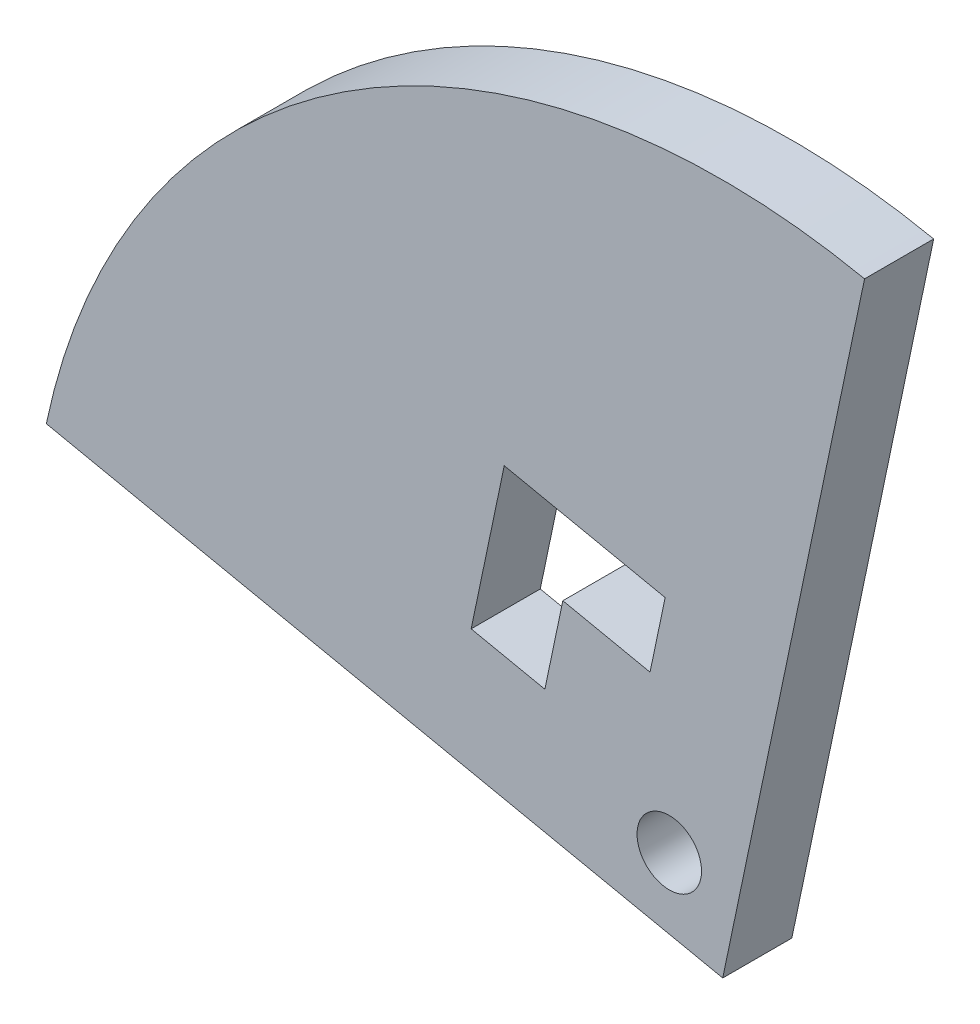
ISO-10303-21;
HEADER;
FILE_DESCRIPTION(('STEP AP214'),'2;1');
FILE_NAME('part.step','',(''),(''),'','','');
FILE_SCHEMA(('AUTOMOTIVE_DESIGN { 1 0 10303 214 1 1 1 1 }'));
ENDSEC;
DATA;
#1=APPLICATION_CONTEXT('core data for automotive mechanical design processes');
#2=APPLICATION_PROTOCOL_DEFINITION('international standard','automotive_design',2000,#1);
#3=PRODUCT_CONTEXT('',#1,'mechanical');
#4=PRODUCT('Part','Part','',(#3));
#5=PRODUCT_RELATED_PRODUCT_CATEGORY('part','',(#4));
#6=PRODUCT_DEFINITION_FORMATION('','',#4);
#7=PRODUCT_DEFINITION_CONTEXT('part definition',#1,'design');
#8=PRODUCT_DEFINITION('design','',#6,#7);
#9=PRODUCT_DEFINITION_SHAPE('','',#8);
#10=(LENGTH_UNIT() NAMED_UNIT(*) SI_UNIT(.MILLI.,.METRE.));
#11=(NAMED_UNIT(*) PLANE_ANGLE_UNIT() SI_UNIT($,.RADIAN.));
#12=(NAMED_UNIT(*) SI_UNIT($,.STERADIAN.) SOLID_ANGLE_UNIT());
#13=UNCERTAINTY_MEASURE_WITH_UNIT(LENGTH_MEASURE(1.E-05),#10,'distance_accuracy_value','');
#14=(GEOMETRIC_REPRESENTATION_CONTEXT(3) GLOBAL_UNCERTAINTY_ASSIGNED_CONTEXT((#13)) GLOBAL_UNIT_ASSIGNED_CONTEXT((#10,
#11,#12)) REPRESENTATION_CONTEXT('',''));
#15=CARTESIAN_POINT('',(0.,0.,0.));
#16=DIRECTION('',(0.,0.,1.));
#17=DIRECTION('',(1.,0.,0.));
#18=AXIS2_PLACEMENT_3D('',#15,#16,#17);
#19=CARTESIAN_POINT('',(-19.0395570775338,22.206218019928,3.81));
#20=DIRECTION('',(0.205214844297288,0.978716949725527,0.));
#21=DIRECTION('',(-0.978716949725527,0.205214844297288,0.));
#22=AXIS2_PLACEMENT_3D('',#19,#20,#21);
#23=PLANE('',#22);
#24=DIRECTION('',(0.978716949725527,-0.205214844297288,0.));
#25=VECTOR('',#24,1.);
#26=CARTESIAN_POINT('',(-19.0395570775338,22.206218019928,0.));
#27=LINE('',#26,#25);
#28=CARTESIAN_POINT('',(-56.3286728620763,30.0249035876546,0.));
#29=VERTEX_POINT('',#28);
#30=CARTESIAN_POINT('',(-19.0395570775338,22.206218019928,0.));
#31=VERTEX_POINT('',#30);
#32=EDGE_CURVE('E159',#29,#31,#27,.T.);
#33=ORIENTED_EDGE('',*,*,#32,.T.);
#34=DIRECTION('',(0.,0.,-1.));
#35=VECTOR('',#34,1.);
#36=CARTESIAN_POINT('',(-19.0395570775338,22.206218019928,3.81));
#37=LINE('',#36,#35);
#38=CARTESIAN_POINT('',(-19.0395570775338,22.206218019928,3.81));
#39=VERTEX_POINT('',#38);
#40=EDGE_CURVE('E11',#39,#31,#37,.T.);
#41=ORIENTED_EDGE('',*,*,#40,.F.);
#42=DIRECTION('',(0.978716949725527,-0.205214844297288,0.));
#43=VECTOR('',#42,1.);
#44=CARTESIAN_POINT('',(-19.0395570775338,22.206218019928,3.81));
#45=LINE('',#44,#43);
#46=CARTESIAN_POINT('',(-56.3286728620763,30.0249035876546,3.81));
#47=VERTEX_POINT('',#46);
#48=EDGE_CURVE('E162',#47,#39,#45,.T.);
#49=ORIENTED_EDGE('',*,*,#48,.F.);
#50=DIRECTION('',(0.,0.,-1.));
#51=VECTOR('',#50,1.);
#52=CARTESIAN_POINT('',(-56.3286728620763,30.0249035876546,3.81));
#53=LINE('',#52,#51);
#54=EDGE_CURVE('E170',#47,#29,#53,.T.);
#55=ORIENTED_EDGE('',*,*,#54,.T.);
#56=EDGE_LOOP('',(#33,#41,#49,#55));
#57=FACE_BOUND('',#56,.T.);
#58=ADVANCED_FACE('F35',(#57),#23,.F.);
#59=CARTESIAN_POINT('',(-11.2208715098071,59.4953338044705,3.81));
#60=DIRECTION('',(-0.978716949725527,0.205214844297288,0.));
#61=DIRECTION('',(-0.205214844297288,-0.978716949725527,0.));
#62=AXIS2_PLACEMENT_3D('',#59,#60,#61);
#63=PLANE('',#62);
#64=DIRECTION('',(0.205214844297288,0.978716949725527,0.));
#65=VECTOR('',#64,1.);
#66=CARTESIAN_POINT('',(-11.2208715098071,59.4953338044705,0.));
#67=LINE('',#66,#65);
#68=CARTESIAN_POINT('',(-11.2208715098071,59.4953338044705,0.));
#69=VERTEX_POINT('',#68);
#70=EDGE_CURVE('E173',#31,#69,#67,.T.);
#71=ORIENTED_EDGE('',*,*,#70,.T.);
#72=DIRECTION('',(0.,0.,-1.));
#73=VECTOR('',#72,1.);
#74=CARTESIAN_POINT('',(-11.2208715098071,59.4953338044705,3.81));
#75=LINE('',#74,#73);
#76=CARTESIAN_POINT('',(-11.2208715098071,59.4953338044705,3.81));
#77=VERTEX_POINT('',#76);
#78=EDGE_CURVE('E42',#77,#69,#75,.T.);
#79=ORIENTED_EDGE('',*,*,#78,.F.);
#80=DIRECTION('',(0.205214844297288,0.978716949725527,0.));
#81=VECTOR('',#80,1.);
#82=CARTESIAN_POINT('',(-11.2208715098071,59.4953338044705,3.81));
#83=LINE('',#82,#81);
#84=EDGE_CURVE('E165',#39,#77,#83,.T.);
#85=ORIENTED_EDGE('',*,*,#84,.F.);
#86=ORIENTED_EDGE('',*,*,#40,.T.);
#87=EDGE_LOOP('',(#71,#79,#85,#86));
#88=FACE_BOUND('',#87,.T.);
#89=ADVANCED_FACE('F192',(#88),#63,.F.);
#90=CARTESIAN_POINT('',(-19.0395570775338,22.206218019928,3.81));
#91=DIRECTION('',(0.,0.,-1.));
#92=DIRECTION('',(-1.,0.,0.));
#93=AXIS2_PLACEMENT_3D('',#90,#91,#92);
#94=CYLINDRICAL_SURFACE('',#93,38.1);
#95=CARTESIAN_POINT('',(-19.0395570775338,22.206218019928,0.));
#96=DIRECTION('',(0.,0.,1.));
#97=DIRECTION('',(1.,0.,0.));
#98=AXIS2_PLACEMENT_3D('',#95,#96,#97);
#99=CIRCLE('',#98,38.1);
#100=EDGE_CURVE('E166',#69,#29,#99,.T.);
#101=ORIENTED_EDGE('',*,*,#100,.T.);
#102=ORIENTED_EDGE('',*,*,#54,.F.);
#103=CARTESIAN_POINT('',(-19.0395570775338,22.206218019928,3.81));
#104=DIRECTION('',(0.,0.,1.));
#105=DIRECTION('',(1.,0.,0.));
#106=AXIS2_PLACEMENT_3D('',#103,#104,#105);
#107=CIRCLE('',#106,38.1);
#108=EDGE_CURVE('E168',#77,#47,#107,.T.);
#109=ORIENTED_EDGE('',*,*,#108,.F.);
#110=ORIENTED_EDGE('',*,*,#78,.T.);
#111=EDGE_LOOP('',(#101,#102,#109,#110));
#112=FACE_BOUND('',#111,.T.);
#113=ADVANCED_FACE('F182',(#112),#94,.T.);
#114=CARTESIAN_POINT('',(-19.0395570775338,22.206218019928,3.81));
#115=DIRECTION('',(0.,0.,1.));
#116=DIRECTION('',(1.,0.,0.));
#117=AXIS2_PLACEMENT_3D('',#114,#115,#116);
#118=PLANE('',#117);
#119=DIRECTION('',(0.978716949725527,-0.205214844297287,0.));
#120=VECTOR('',#119,1.);
#121=CARTESIAN_POINT('',(6.85372622779771,32.6870020094969,3.81));
#122=LINE('',#121,#120);
#123=CARTESIAN_POINT('',(-31.084073206566,40.6417018908957,3.81));
#124=VERTEX_POINT('',#123);
#125=CARTESIAN_POINT('',(-22.2130008779914,38.78163833813,3.81));
#126=VERTEX_POINT('',#125);
#127=EDGE_CURVE('E107',#124,#126,#122,.T.);
#128=ORIENTED_EDGE('',*,*,#127,.T.);
#129=DIRECTION('',(-0.205214844297289,-0.978716949725527,0.));
#130=VECTOR('',#129,1.);
#131=CARTESIAN_POINT('',(-29.0667271057892,6.09463632863324,3.81));
#132=LINE('',#131,#130);
#133=CARTESIAN_POINT('',(-23.0469940052156,34.8041326544455,3.81));
#134=VERTEX_POINT('',#133);
#135=EDGE_CURVE('E113',#126,#134,#132,.T.);
#136=ORIENTED_EDGE('',*,*,#135,.T.);
#137=DIRECTION('',(0.978716949725527,-0.205214844297288,0.));
#138=VECTOR('',#137,1.);
#139=CARTESIAN_POINT('',(6.01973310057355,28.7094963258123,3.81));
#140=LINE('',#139,#138);
#141=CARTESIAN_POINT('',(-27.8540663337902,35.8120671749531,3.81));
#142=VERTEX_POINT('',#141);
#143=EDGE_CURVE('E117',#142,#134,#140,.T.);
#144=ORIENTED_EDGE('',*,*,#143,.F.);
#145=DIRECTION('',(-0.205214844297289,-0.978716949725527,0.));
#146=VECTOR('',#145,1.);
#147=CARTESIAN_POINT('',(-33.8737994343638,7.10257084914083,3.81));
#148=LINE('',#147,#146);
#149=CARTESIAN_POINT('',(-28.8444331723689,31.0887791755777,3.81));
#150=VERTEX_POINT('',#149);
#151=EDGE_CURVE('E129',#142,#150,#148,.T.);
#152=ORIENTED_EDGE('',*,*,#151,.T.);
#153=DIRECTION('',(-0.978716949725527,0.205214844297289,0.));
#154=VECTOR('',#153,1.);
#155=CARTESIAN_POINT('',(5.02936626199485,23.9862083264369,3.81));
#156=LINE('',#155,#154);
#157=CARTESIAN_POINT('',(-32.9084331723689,31.9409082078358,3.81));
#158=VERTEX_POINT('',#157);
#159=EDGE_CURVE('E132',#150,#158,#156,.T.);
#160=ORIENTED_EDGE('',*,*,#159,.T.);
#161=DIRECTION('',(-0.205214844297288,-0.978716949725527,0.));
#162=VECTOR('',#161,1.);
#163=CARTESIAN_POINT('',(-37.9377994343637,7.95469988139887,3.81));
#164=LINE('',#163,#162);
#165=EDGE_CURVE('E110',#124,#158,#164,.T.);
#166=ORIENTED_EDGE('',*,*,#165,.F.);
#167=EDGE_LOOP('',(#128,#136,#144,#152,#160,#166));
#168=FACE_BOUND('',#167,.T.);
#169=CARTESIAN_POINT('',(-21.9866000992154,26.7169981551549,3.81));
#170=DIRECTION('',(0.,0.,1.));
#171=DIRECTION('',(1.,0.,0.));
#172=AXIS2_PLACEMENT_3D('',#169,#170,#171);
#173=CIRCLE('',#172,1.77800000000001);
#174=CARTESIAN_POINT('',(-20.2086000992153,26.7169981551549,3.81));
#175=VERTEX_POINT('',#174);
#176=EDGE_CURVE('E148',#175,#175,#173,.T.);
#177=ORIENTED_EDGE('',*,*,#176,.F.);
#178=EDGE_LOOP('',(#177));
#179=FACE_BOUND('',#178,.T.);
#180=ORIENTED_EDGE('',*,*,#48,.T.);
#181=ORIENTED_EDGE('',*,*,#84,.T.);
#182=ORIENTED_EDGE('',*,*,#108,.T.);
#183=EDGE_LOOP('',(#180,#181,#182));
#184=FACE_BOUND('',#183,.T.);
#185=ADVANCED_FACE('F119',(#168,#179,#184),#118,.T.);
#186=CARTESIAN_POINT('',(-19.0395570775338,22.206218019928,0.));
#187=DIRECTION('',(0.,0.,1.));
#188=DIRECTION('',(1.,0.,0.));
#189=AXIS2_PLACEMENT_3D('',#186,#187,#188);
#190=PLANE('',#189);
#191=DIRECTION('',(-0.205214844297289,-0.978716949725527,0.));
#192=VECTOR('',#191,1.);
#193=CARTESIAN_POINT('',(-29.0667271057892,6.09463632863324,0.));
#194=LINE('',#193,#192);
#195=CARTESIAN_POINT('',(-22.2130008779914,38.78163833813,0.));
#196=VERTEX_POINT('',#195);
#197=CARTESIAN_POINT('',(-23.0469940052156,34.8041326544455,0.));
#198=VERTEX_POINT('',#197);
#199=EDGE_CURVE('E136',#196,#198,#194,.T.);
#200=ORIENTED_EDGE('',*,*,#199,.F.);
#201=DIRECTION('',(0.978716949725527,-0.205214844297287,0.));
#202=VECTOR('',#201,1.);
#203=CARTESIAN_POINT('',(6.85372622779771,32.6870020094969,0.));
#204=LINE('',#203,#202);
#205=CARTESIAN_POINT('',(-31.084073206566,40.6417018908957,0.));
#206=VERTEX_POINT('',#205);
#207=EDGE_CURVE('E57',#206,#196,#204,.T.);
#208=ORIENTED_EDGE('',*,*,#207,.F.);
#209=DIRECTION('',(-0.205214844297288,-0.978716949725527,0.));
#210=VECTOR('',#209,1.);
#211=CARTESIAN_POINT('',(-37.9377994343637,7.95469988139887,0.));
#212=LINE('',#211,#210);
#213=CARTESIAN_POINT('',(-32.9084331723689,31.9409082078358,0.));
#214=VERTEX_POINT('',#213);
#215=EDGE_CURVE('E122',#206,#214,#212,.T.);
#216=ORIENTED_EDGE('',*,*,#215,.T.);
#217=DIRECTION('',(-0.978716949725527,0.205214844297289,0.));
#218=VECTOR('',#217,1.);
#219=CARTESIAN_POINT('',(5.02936626199485,23.9862083264369,0.));
#220=LINE('',#219,#218);
#221=CARTESIAN_POINT('',(-28.8444331723689,31.0887791755777,0.));
#222=VERTEX_POINT('',#221);
#223=EDGE_CURVE('E125',#222,#214,#220,.T.);
#224=ORIENTED_EDGE('',*,*,#223,.F.);
#225=DIRECTION('',(-0.205214844297289,-0.978716949725527,0.));
#226=VECTOR('',#225,1.);
#227=CARTESIAN_POINT('',(-33.8737994343638,7.10257084914083,0.));
#228=LINE('',#227,#226);
#229=CARTESIAN_POINT('',(-27.8540663337902,35.8120671749531,0.));
#230=VERTEX_POINT('',#229);
#231=EDGE_CURVE('E141',#230,#222,#228,.T.);
#232=ORIENTED_EDGE('',*,*,#231,.F.);
#233=DIRECTION('',(0.978716949725527,-0.205214844297288,0.));
#234=VECTOR('',#233,1.);
#235=CARTESIAN_POINT('',(6.01973310057355,28.7094963258123,0.));
#236=LINE('',#235,#234);
#237=EDGE_CURVE('E138',#230,#198,#236,.T.);
#238=ORIENTED_EDGE('',*,*,#237,.T.);
#239=EDGE_LOOP('',(#200,#208,#216,#224,#232,#238));
#240=FACE_BOUND('',#239,.T.);
#241=CARTESIAN_POINT('',(-21.9866000992154,26.7169981551549,0.));
#242=DIRECTION('',(0.,0.,1.));
#243=DIRECTION('',(1.,0.,0.));
#244=AXIS2_PLACEMENT_3D('',#241,#242,#243);
#245=CIRCLE('',#244,1.77800000000001);
#246=CARTESIAN_POINT('',(-20.2086000992153,26.7169981551549,0.));
#247=VERTEX_POINT('',#246);
#248=EDGE_CURVE('E156',#247,#247,#245,.T.);
#249=ORIENTED_EDGE('',*,*,#248,.T.);
#250=EDGE_LOOP('',(#249));
#251=FACE_BOUND('',#250,.T.);
#252=ORIENTED_EDGE('',*,*,#32,.F.);
#253=ORIENTED_EDGE('',*,*,#100,.F.);
#254=ORIENTED_EDGE('',*,*,#70,.F.);
#255=EDGE_LOOP('',(#252,#253,#254));
#256=FACE_BOUND('',#255,.T.);
#257=ADVANCED_FACE('F187',(#240,#251,#256),#190,.F.);
#258=CARTESIAN_POINT('',(-21.9866000992154,26.7169981551549,0.));
#259=DIRECTION('',(0.,0.,1.));
#260=DIRECTION('',(1.,0.,0.));
#261=AXIS2_PLACEMENT_3D('',#258,#259,#260);
#262=CYLINDRICAL_SURFACE('',#261,1.77800000000001);
#263=CARTESIAN_POINT('',(-20.2086000992153,26.7169981551549,0.));
#264=CARTESIAN_POINT('',(-20.2086000992153,26.7169981551549,0.0396874999999999));
#265=CARTESIAN_POINT('',(-20.2086000992153,26.7169981551549,0.079375));
#266=CARTESIAN_POINT('',(-20.2086000992153,26.7169981551549,0.15875));
#267=CARTESIAN_POINT('',(-20.2086000992153,26.7169981551549,0.1984375));
#268=CARTESIAN_POINT('',(-20.2086000992153,26.7169981551549,0.2778125));
#269=CARTESIAN_POINT('',(-20.2086000992153,26.7169981551549,0.3175));
#270=CARTESIAN_POINT('',(-20.2086000992153,26.7169981551549,0.396875));
#271=CARTESIAN_POINT('',(-20.2086000992153,26.7169981551549,0.4365625));
#272=CARTESIAN_POINT('',(-20.2086000992153,26.7169981551549,0.5159375));
#273=CARTESIAN_POINT('',(-20.2086000992153,26.7169981551549,0.555625));
#274=CARTESIAN_POINT('',(-20.2086000992153,26.7169981551549,0.635));
#275=CARTESIAN_POINT('',(-20.2086000992153,26.7169981551549,0.6746875));
#276=CARTESIAN_POINT('',(-20.2086000992153,26.7169981551549,0.7540625));
#277=CARTESIAN_POINT('',(-20.2086000992153,26.7169981551549,0.79375));
#278=CARTESIAN_POINT('',(-20.2086000992153,26.7169981551549,0.873125));
#279=CARTESIAN_POINT('',(-20.2086000992153,26.7169981551549,0.9128125));
#280=CARTESIAN_POINT('',(-20.2086000992153,26.7169981551549,0.9921875));
#281=CARTESIAN_POINT('',(-20.2086000992153,26.7169981551549,1.031875));
#282=CARTESIAN_POINT('',(-20.2086000992153,26.7169981551549,1.11125));
#283=CARTESIAN_POINT('',(-20.2086000992153,26.7169981551549,1.1509375));
#284=CARTESIAN_POINT('',(-20.2086000992153,26.7169981551549,1.2303125));
#285=CARTESIAN_POINT('',(-20.2086000992153,26.7169981551549,1.27));
#286=CARTESIAN_POINT('',(-20.2086000992153,26.7169981551549,1.349375));
#287=CARTESIAN_POINT('',(-20.2086000992153,26.7169981551549,1.3890625));
#288=CARTESIAN_POINT('',(-20.2086000992153,26.7169981551549,1.4684375));
#289=CARTESIAN_POINT('',(-20.2086000992153,26.7169981551549,1.508125));
#290=CARTESIAN_POINT('',(-20.2086000992153,26.7169981551549,1.5875));
#291=CARTESIAN_POINT('',(-20.2086000992153,26.7169981551549,1.6271875));
#292=CARTESIAN_POINT('',(-20.2086000992153,26.7169981551549,1.7065625));
#293=CARTESIAN_POINT('',(-20.2086000992153,26.7169981551549,1.74625));
#294=CARTESIAN_POINT('',(-20.2086000992153,26.7169981551549,1.825625));
#295=CARTESIAN_POINT('',(-20.2086000992153,26.7169981551549,1.8653125));
#296=CARTESIAN_POINT('',(-20.2086000992153,26.7169981551549,1.9446875));
#297=CARTESIAN_POINT('',(-20.2086000992153,26.7169981551549,1.984375));
#298=CARTESIAN_POINT('',(-20.2086000992153,26.7169981551549,2.06375));
#299=CARTESIAN_POINT('',(-20.2086000992153,26.7169981551549,2.1034375));
#300=CARTESIAN_POINT('',(-20.2086000992153,26.7169981551549,2.1828125));
#301=CARTESIAN_POINT('',(-20.2086000992153,26.7169981551549,2.2225));
#302=CARTESIAN_POINT('',(-20.2086000992153,26.7169981551549,2.301875));
#303=CARTESIAN_POINT('',(-20.2086000992153,26.7169981551549,2.3415625));
#304=CARTESIAN_POINT('',(-20.2086000992153,26.7169981551549,2.4209375));
#305=CARTESIAN_POINT('',(-20.2086000992153,26.7169981551549,2.460625));
#306=CARTESIAN_POINT('',(-20.2086000992153,26.7169981551549,2.54));
#307=CARTESIAN_POINT('',(-20.2086000992153,26.7169981551549,2.5796875));
#308=CARTESIAN_POINT('',(-20.2086000992153,26.7169981551549,2.6590625));
#309=CARTESIAN_POINT('',(-20.2086000992153,26.7169981551549,2.69875));
#310=CARTESIAN_POINT('',(-20.2086000992153,26.7169981551549,2.778125));
#311=CARTESIAN_POINT('',(-20.2086000992153,26.7169981551549,2.8178125));
#312=CARTESIAN_POINT('',(-20.2086000992153,26.7169981551549,2.8971875));
#313=CARTESIAN_POINT('',(-20.2086000992153,26.7169981551549,2.936875));
#314=CARTESIAN_POINT('',(-20.2086000992153,26.7169981551549,3.01625));
#315=CARTESIAN_POINT('',(-20.2086000992153,26.7169981551549,3.0559375));
#316=CARTESIAN_POINT('',(-20.2086000992153,26.7169981551549,3.1353125));
#317=CARTESIAN_POINT('',(-20.2086000992153,26.7169981551549,3.175));
#318=CARTESIAN_POINT('',(-20.2086000992153,26.7169981551549,3.254375));
#319=CARTESIAN_POINT('',(-20.2086000992153,26.7169981551549,3.2940625));
#320=CARTESIAN_POINT('',(-20.2086000992153,26.7169981551549,3.3734375));
#321=CARTESIAN_POINT('',(-20.2086000992153,26.7169981551549,3.413125));
#322=CARTESIAN_POINT('',(-20.2086000992153,26.7169981551549,3.4925));
#323=CARTESIAN_POINT('',(-20.2086000992153,26.7169981551549,3.5321875));
#324=CARTESIAN_POINT('',(-20.2086000992153,26.7169981551549,3.6115625));
#325=CARTESIAN_POINT('',(-20.2086000992153,26.7169981551549,3.65125));
#326=CARTESIAN_POINT('',(-20.2086000992153,26.7169981551549,3.730625));
#327=CARTESIAN_POINT('',(-20.2086000992153,26.7169981551549,3.7703125));
#328=CARTESIAN_POINT('',(-20.2086000992153,26.7169981551549,3.81));
#329=B_SPLINE_CURVE_WITH_KNOTS('',3,(#263,#264,#265,#266,#267,#268,#269,#270,#271,#272,#273,
#274,#275,#276,#277,#278,#279,#280,#281,#282,#283,#284,#285,#286,#287,#288,#289,#290,#291,#292,
#293,#294,#295,#296,#297,#298,#299,#300,#301,#302,#303,#304,#305,#306,#307,#308,#309,#310,#311,
#312,#313,#314,#315,#316,#317,#318,#319,#320,#321,#322,#323,#324,#325,#326,#327,#328),
.UNSPECIFIED.,.F.,.F.,(4,2,2,2,2,2,2,2,2,2,2,2,2,2,2,2,2,2,2,2,2,2,2,2,2,2,2,2,2,2,2,2,4),(0.,
0.1190625,0.238125,0.3571875,0.47625,0.5953125,0.714375,0.8334375,0.9525,1.0715625,1.190625,
1.3096875,1.42875,1.5478125,1.666875,1.7859375,1.905,2.0240625,2.143125,2.2621875,2.38125,
2.5003125,2.619375,2.7384375,2.8575,2.9765625,3.095625,3.2146875,3.33375,3.4528125,3.571875,
3.6909375,3.81),.UNSPECIFIED.);
#330=EDGE_CURVE('BSEAM202',#247,#175,#329,.T.);
#331=ORIENTED_EDGE('',*,*,#248,.F.);
#332=ORIENTED_EDGE('',*,*,#176,.T.);
#333=ORIENTED_EDGE('',*,*,#330,.T.);
#334=ORIENTED_EDGE('',*,*,#330,.F.);
#335=EDGE_LOOP('',(#331,#333,#332,#334));
#336=FACE_BOUND('',#335,.T.);
#337=ADVANCED_FACE('F202',(#336),#262,.F.);
#338=CARTESIAN_POINT('',(6.85372622779771,32.6870020094969,3.81));
#339=DIRECTION('',(0.205214844297287,0.978716949725527,0.));
#340=DIRECTION('',(-0.978716949725527,0.205214844297287,0.));
#341=AXIS2_PLACEMENT_3D('',#338,#339,#340);
#342=PLANE('',#341);
#343=ORIENTED_EDGE('',*,*,#207,.T.);
#344=DIRECTION('',(0.,0.,-1.));
#345=VECTOR('',#344,1.);
#346=CARTESIAN_POINT('',(-22.2130008779914,38.78163833813,3.81));
#347=LINE('',#346,#345);
#348=EDGE_CURVE('E104',#126,#196,#347,.T.);
#349=ORIENTED_EDGE('',*,*,#348,.F.);
#350=ORIENTED_EDGE('',*,*,#127,.F.);
#351=DIRECTION('',(0.,0.,-1.));
#352=VECTOR('',#351,1.);
#353=CARTESIAN_POINT('',(-31.084073206566,40.6417018908957,3.81));
#354=LINE('',#353,#352);
#355=EDGE_CURVE('E146',#124,#206,#354,.T.);
#356=ORIENTED_EDGE('',*,*,#355,.T.);
#357=EDGE_LOOP('',(#343,#349,#350,#356));
#358=FACE_BOUND('',#357,.T.);
#359=ADVANCED_FACE('F105',(#358),#342,.F.);
#360=CARTESIAN_POINT('',(-37.9377994343637,7.95469988139887,3.81));
#361=DIRECTION('',(0.978716949725527,-0.205214844297288,0.));
#362=DIRECTION('',(0.205214844297288,0.978716949725527,0.));
#363=AXIS2_PLACEMENT_3D('',#360,#361,#362);
#364=PLANE('',#363);
#365=ORIENTED_EDGE('',*,*,#215,.F.);
#366=ORIENTED_EDGE('',*,*,#355,.F.);
#367=ORIENTED_EDGE('',*,*,#165,.T.);
#368=DIRECTION('',(0.,0.,-1.));
#369=VECTOR('',#368,1.);
#370=CARTESIAN_POINT('',(-32.9084331723689,31.9409082078358,3.81));
#371=LINE('',#370,#369);
#372=EDGE_CURVE('E149',#158,#214,#371,.T.);
#373=ORIENTED_EDGE('',*,*,#372,.T.);
#374=EDGE_LOOP('',(#365,#366,#367,#373));
#375=FACE_BOUND('',#374,.T.);
#376=ADVANCED_FACE('F211',(#375),#364,.T.);
#377=CARTESIAN_POINT('',(5.02936626199485,23.9862083264369,3.81));
#378=DIRECTION('',(-0.205214844297289,-0.978716949725527,0.));
#379=DIRECTION('',(0.978716949725527,-0.205214844297289,0.));
#380=AXIS2_PLACEMENT_3D('',#377,#378,#379);
#381=PLANE('',#380);
#382=ORIENTED_EDGE('',*,*,#223,.T.);
#383=ORIENTED_EDGE('',*,*,#372,.F.);
#384=ORIENTED_EDGE('',*,*,#159,.F.);
#385=DIRECTION('',(0.,0.,-1.));
#386=VECTOR('',#385,1.);
#387=CARTESIAN_POINT('',(-28.8444331723689,31.0887791755777,3.81));
#388=LINE('',#387,#386);
#389=EDGE_CURVE('E151',#150,#222,#388,.T.);
#390=ORIENTED_EDGE('',*,*,#389,.T.);
#391=EDGE_LOOP('',(#382,#383,#384,#390));
#392=FACE_BOUND('',#391,.T.);
#393=ADVANCED_FACE('F221',(#392),#381,.F.);
#394=CARTESIAN_POINT('',(-33.8737994343638,7.10257084914083,3.81));
#395=DIRECTION('',(0.978716949725527,-0.205214844297289,0.));
#396=DIRECTION('',(0.205214844297289,0.978716949725527,0.));
#397=AXIS2_PLACEMENT_3D('',#394,#395,#396);
#398=PLANE('',#397);
#399=ORIENTED_EDGE('',*,*,#231,.T.);
#400=ORIENTED_EDGE('',*,*,#389,.F.);
#401=ORIENTED_EDGE('',*,*,#151,.F.);
#402=DIRECTION('',(0.,0.,-1.));
#403=VECTOR('',#402,1.);
#404=CARTESIAN_POINT('',(-27.8540663337902,35.8120671749531,3.81));
#405=LINE('',#404,#403);
#406=EDGE_CURVE('E153',#142,#230,#405,.T.);
#407=ORIENTED_EDGE('',*,*,#406,.T.);
#408=EDGE_LOOP('',(#399,#400,#401,#407));
#409=FACE_BOUND('',#408,.T.);
#410=ADVANCED_FACE('F217',(#409),#398,.F.);
#411=CARTESIAN_POINT('',(6.01973310057355,28.7094963258123,3.81));
#412=DIRECTION('',(0.205214844297288,0.978716949725527,0.));
#413=DIRECTION('',(-0.978716949725527,0.205214844297288,0.));
#414=AXIS2_PLACEMENT_3D('',#411,#412,#413);
#415=PLANE('',#414);
#416=ORIENTED_EDGE('',*,*,#237,.F.);
#417=ORIENTED_EDGE('',*,*,#406,.F.);
#418=ORIENTED_EDGE('',*,*,#143,.T.);
#419=DIRECTION('',(0.,0.,-1.));
#420=VECTOR('',#419,1.);
#421=CARTESIAN_POINT('',(-23.0469940052156,34.8041326544455,3.81));
#422=LINE('',#421,#420);
#423=EDGE_CURVE('E49',#134,#198,#422,.T.);
#424=ORIENTED_EDGE('',*,*,#423,.T.);
#425=EDGE_LOOP('',(#416,#417,#418,#424));
#426=FACE_BOUND('',#425,.T.);
#427=ADVANCED_FACE('F214',(#426),#415,.T.);
#428=CARTESIAN_POINT('',(-29.0667271057892,6.09463632863324,3.81));
#429=DIRECTION('',(0.978716949725527,-0.205214844297289,0.));
#430=DIRECTION('',(0.205214844297289,0.978716949725527,0.));
#431=AXIS2_PLACEMENT_3D('',#428,#429,#430);
#432=PLANE('',#431);
#433=ORIENTED_EDGE('',*,*,#199,.T.);
#434=ORIENTED_EDGE('',*,*,#423,.F.);
#435=ORIENTED_EDGE('',*,*,#135,.F.);
#436=ORIENTED_EDGE('',*,*,#348,.T.);
#437=EDGE_LOOP('',(#433,#434,#435,#436));
#438=FACE_BOUND('',#437,.T.);
#439=ADVANCED_FACE('F114',(#438),#432,.F.);
#440=CLOSED_SHELL('',(#58,#89,#113,#185,#257,#337,#359,#376,#393,#410,#427,#439));
#441=MANIFOLD_SOLID_BREP('B2',#440);
#442=ADVANCED_BREP_SHAPE_REPRESENTATION('',(#18,#441),#14);
#443=SHAPE_DEFINITION_REPRESENTATION(#9,#442);
ENDSEC;
END-ISO-10303-21;
